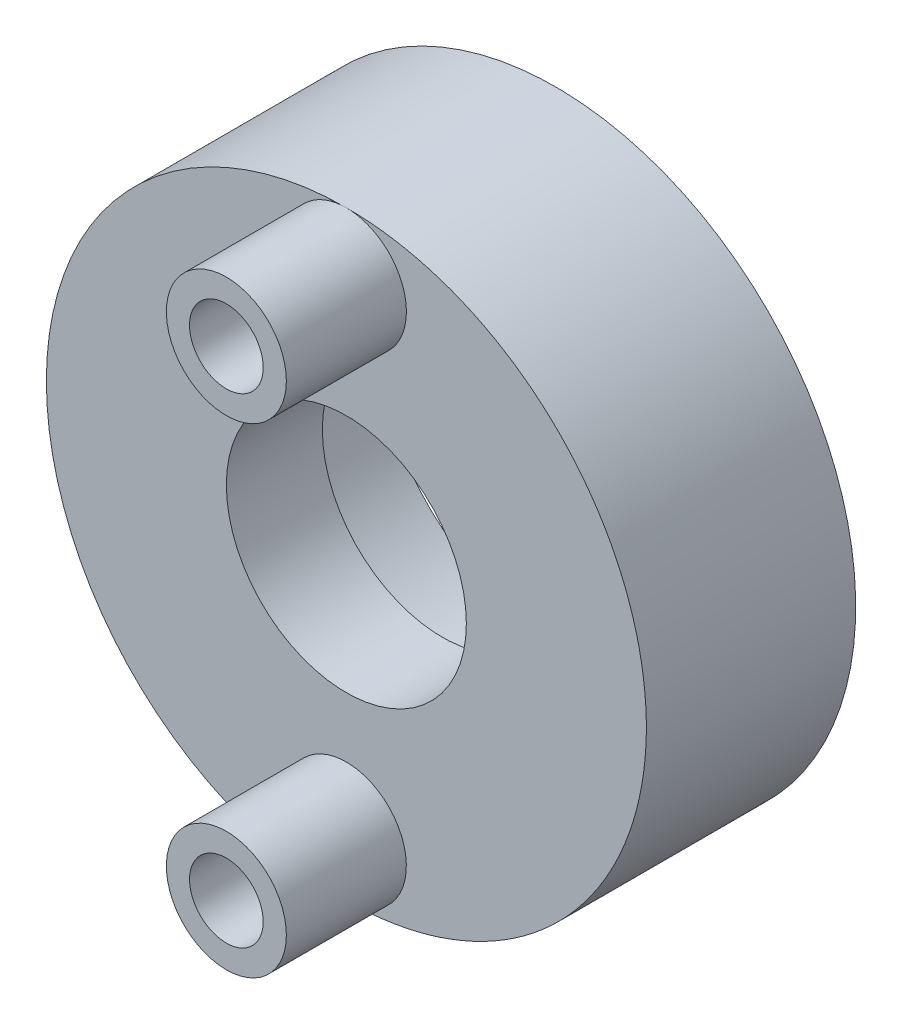
ISO-10303-21;
HEADER;
FILE_DESCRIPTION(('STEP AP214'),'2;1');
FILE_NAME('part.step','',(''),(''),'','','');
FILE_SCHEMA(('AUTOMOTIVE_DESIGN { 1 0 10303 214 1 1 1 1 }'));
ENDSEC;
DATA;
#1=APPLICATION_CONTEXT('core data for automotive mechanical design processes');
#2=APPLICATION_PROTOCOL_DEFINITION('international standard','automotive_design',2000,#1);
#3=PRODUCT_CONTEXT('',#1,'mechanical');
#4=PRODUCT('Part','Part','',(#3));
#5=PRODUCT_RELATED_PRODUCT_CATEGORY('part','',(#4));
#6=PRODUCT_DEFINITION_FORMATION('','',#4);
#7=PRODUCT_DEFINITION_CONTEXT('part definition',#1,'design');
#8=PRODUCT_DEFINITION('design','',#6,#7);
#9=PRODUCT_DEFINITION_SHAPE('','',#8);
#10=(LENGTH_UNIT() NAMED_UNIT(*) SI_UNIT(.MILLI.,.METRE.));
#11=(NAMED_UNIT(*) PLANE_ANGLE_UNIT() SI_UNIT($,.RADIAN.));
#12=(NAMED_UNIT(*) SI_UNIT($,.STERADIAN.) SOLID_ANGLE_UNIT());
#13=UNCERTAINTY_MEASURE_WITH_UNIT(LENGTH_MEASURE(1.E-05),#10,'distance_accuracy_value','');
#14=(GEOMETRIC_REPRESENTATION_CONTEXT(3) GLOBAL_UNCERTAINTY_ASSIGNED_CONTEXT((#13)) GLOBAL_UNIT_ASSIGNED_CONTEXT((#10,
#11,#12)) REPRESENTATION_CONTEXT('',''));
#15=CARTESIAN_POINT('',(0.,0.,0.));
#16=DIRECTION('',(0.,0.,1.));
#17=DIRECTION('',(1.,0.,0.));
#18=AXIS2_PLACEMENT_3D('',#15,#16,#17);
#19=CARTESIAN_POINT('',(0.,0.,-5.08));
#20=DIRECTION('',(0.,0.,1.));
#21=DIRECTION('',(1.,0.,0.));
#22=AXIS2_PLACEMENT_3D('',#19,#20,#21);
#23=PLANE('',#22);
#24=CARTESIAN_POINT('',(0.,0.,-5.08));
#25=DIRECTION('',(0.,0.,1.));
#26=DIRECTION('',(1.,0.,0.));
#27=AXIS2_PLACEMENT_3D('',#24,#25,#26);
#28=CIRCLE('',#27,6.35);
#29=CARTESIAN_POINT('',(6.35,0.,-5.08));
#30=VERTEX_POINT('',#29);
#31=EDGE_CURVE('E60',#30,#30,#28,.T.);
#32=ORIENTED_EDGE('',*,*,#31,.T.);
#33=EDGE_LOOP('',(#32));
#34=FACE_BOUND('',#33,.T.);
#35=CARTESIAN_POINT('',(0.,0.,-5.08));
#36=DIRECTION('',(0.,0.,-1.));
#37=DIRECTION('',(-1.,0.,0.));
#38=AXIS2_PLACEMENT_3D('',#35,#36,#37);
#39=CIRCLE('',#38,9.5);
#40=CARTESIAN_POINT('',(-9.5,0.,-5.08));
#41=VERTEX_POINT('',#40);
#42=EDGE_CURVE('E116',#41,#41,#39,.T.);
#43=ORIENTED_EDGE('',*,*,#42,.T.);
#44=EDGE_LOOP('',(#43));
#45=FACE_BOUND('',#44,.T.);
#46=ADVANCED_FACE('F50',(#34,#45),#23,.F.);
#47=CARTESIAN_POINT('',(0.,0.,0.));
#48=DIRECTION('',(0.,0.,1.));
#49=DIRECTION('',(1.,0.,0.));
#50=AXIS2_PLACEMENT_3D('',#47,#48,#49);
#51=PLANE('',#50);
#52=CARTESIAN_POINT('',(0.,0.,0.));
#53=DIRECTION('',(0.,0.,1.));
#54=DIRECTION('',(1.,0.,0.));
#55=AXIS2_PLACEMENT_3D('',#52,#53,#54);
#56=CIRCLE('',#55,6.35);
#57=CARTESIAN_POINT('',(6.35,0.,0.));
#58=VERTEX_POINT('',#57);
#59=EDGE_CURVE('E78',#58,#58,#56,.T.);
#60=ORIENTED_EDGE('',*,*,#59,.F.);
#61=EDGE_LOOP('',(#60));
#62=FACE_BOUND('',#61,.T.);
#63=CARTESIAN_POINT('',(0.,0.,0.));
#64=DIRECTION('',(0.,0.,1.));
#65=DIRECTION('',(1.,0.,0.));
#66=AXIS2_PLACEMENT_3D('',#63,#64,#65);
#67=CIRCLE('',#66,15.875);
#68=CARTESIAN_POINT('',(0.,-15.875,0.));
#69=VERTEX_POINT('',#68);
#70=CARTESIAN_POINT('',(0.,15.875,0.));
#71=VERTEX_POINT('',#70);
#72=EDGE_CURVE('E72',#69,#71,#67,.T.);
#73=ORIENTED_EDGE('',*,*,#72,.T.);
#74=CARTESIAN_POINT('',(0.,12.7,0.));
#75=DIRECTION('',(0.,0.,1.));
#76=DIRECTION('',(1.,0.,0.));
#77=AXIS2_PLACEMENT_3D('',#74,#75,#76);
#78=CIRCLE('',#77,3.175);
#79=EDGE_CURVE('E76',#71,#71,#78,.T.);
#80=ORIENTED_EDGE('',*,*,#79,.F.);
#81=EDGE_CURVE('E51',#71,#69,#67,.T.);
#82=ORIENTED_EDGE('',*,*,#81,.T.);
#83=CARTESIAN_POINT('',(0.,-12.7,0.));
#84=DIRECTION('',(0.,0.,1.));
#85=DIRECTION('',(1.,0.,0.));
#86=AXIS2_PLACEMENT_3D('',#83,#84,#85);
#87=CIRCLE('',#86,3.175);
#88=EDGE_CURVE('E65',#69,#69,#87,.F.);
#89=ORIENTED_EDGE('',*,*,#88,.T.);
#90=EDGE_LOOP('',(#73,#80,#82,#89));
#91=FACE_BOUND('',#90,.T.);
#92=ADVANCED_FACE('F73',(#62,#91),#51,.T.);
#93=CARTESIAN_POINT('',(0.,12.7,-5.08));
#94=DIRECTION('',(0.,0.,1.));
#95=DIRECTION('',(1.,0.,0.));
#96=AXIS2_PLACEMENT_3D('',#93,#94,#95);
#97=CYLINDRICAL_SURFACE('',#96,1.95);
#98=CARTESIAN_POINT('',(0.,12.7,-5.08));
#99=DIRECTION('',(0.,0.,1.));
#100=DIRECTION('',(1.,0.,0.));
#101=AXIS2_PLACEMENT_3D('',#98,#99,#100);
#102=CIRCLE('',#101,1.95);
#103=CARTESIAN_POINT('',(1.95,12.7,-5.08));
#104=VERTEX_POINT('',#103);
#105=EDGE_CURVE('E11',#104,#104,#102,.T.);
#106=ORIENTED_EDGE('',*,*,#105,.F.);
#107=EDGE_LOOP('',(#106));
#108=FACE_BOUND('',#107,.T.);
#109=CARTESIAN_POINT('',(0.,12.7,6.35));
#110=DIRECTION('',(0.,0.,1.));
#111=DIRECTION('',(1.,0.,0.));
#112=AXIS2_PLACEMENT_3D('',#109,#110,#111);
#113=CIRCLE('',#112,1.95);
#114=CARTESIAN_POINT('',(1.95,12.7,6.35));
#115=VERTEX_POINT('',#114);
#116=EDGE_CURVE('E87',#115,#115,#113,.T.);
#117=ORIENTED_EDGE('',*,*,#116,.T.);
#118=EDGE_LOOP('',(#117));
#119=FACE_BOUND('',#118,.T.);
#120=ADVANCED_FACE('F147',(#108,#119),#97,.F.);
#121=CARTESIAN_POINT('',(0.,0.,-5.08));
#122=DIRECTION('',(0.,0.,1.));
#123=DIRECTION('',(1.,0.,0.));
#124=AXIS2_PLACEMENT_3D('',#121,#122,#123);
#125=CYLINDRICAL_SURFACE('',#124,15.875);
#126=ORIENTED_EDGE('',*,*,#81,.F.);
#127=ORIENTED_EDGE('',*,*,#72,.F.);
#128=EDGE_LOOP('',(#126,#127));
#129=FACE_BOUND('',#128,.T.);
#130=CARTESIAN_POINT('',(0.,0.,-11.08));
#131=DIRECTION('',(0.,0.,-1.));
#132=DIRECTION('',(-1.,0.,0.));
#133=AXIS2_PLACEMENT_3D('',#130,#131,#132);
#134=CIRCLE('',#133,15.875);
#135=CARTESIAN_POINT('',(-15.875,0.,-11.08));
#136=VERTEX_POINT('',#135);
#137=EDGE_CURVE('E91',#136,#136,#134,.T.);
#138=ORIENTED_EDGE('',*,*,#137,.F.);
#139=EDGE_LOOP('',(#138));
#140=FACE_BOUND('',#139,.T.);
#141=ADVANCED_FACE('F68',(#129,#140),#125,.T.);
#142=CARTESIAN_POINT('',(0.,0.,-5.08));
#143=DIRECTION('',(0.,0.,1.));
#144=DIRECTION('',(1.,0.,0.));
#145=AXIS2_PLACEMENT_3D('',#142,#143,#144);
#146=CYLINDRICAL_SURFACE('',#145,6.35);
#147=ORIENTED_EDGE('',*,*,#31,.F.);
#148=EDGE_LOOP('',(#147));
#149=FACE_BOUND('',#148,.T.);
#150=ORIENTED_EDGE('',*,*,#59,.T.);
#151=EDGE_LOOP('',(#150));
#152=FACE_BOUND('',#151,.T.);
#153=ADVANCED_FACE('F47',(#149,#152),#146,.F.);
#154=CARTESIAN_POINT('',(0.,-12.7,-5.08));
#155=DIRECTION('',(0.,0.,1.));
#156=DIRECTION('',(1.,0.,0.));
#157=AXIS2_PLACEMENT_3D('',#154,#155,#156);
#158=CYLINDRICAL_SURFACE('',#157,1.95);
#159=CARTESIAN_POINT('',(0.,-12.7,-5.08));
#160=DIRECTION('',(0.,0.,1.));
#161=DIRECTION('',(1.,0.,0.));
#162=AXIS2_PLACEMENT_3D('',#159,#160,#161);
#163=CIRCLE('',#162,1.95);
#164=CARTESIAN_POINT('',(1.95,-12.7,-5.08));
#165=VERTEX_POINT('',#164);
#166=EDGE_CURVE('E89',#165,#165,#163,.F.);
#167=ORIENTED_EDGE('',*,*,#166,.T.);
#168=EDGE_LOOP('',(#167));
#169=FACE_BOUND('',#168,.T.);
#170=CARTESIAN_POINT('',(0.,-12.7,6.35));
#171=DIRECTION('',(0.,0.,1.));
#172=DIRECTION('',(1.,0.,0.));
#173=AXIS2_PLACEMENT_3D('',#170,#171,#172);
#174=CIRCLE('',#173,1.95);
#175=CARTESIAN_POINT('',(1.95,-12.7,6.35));
#176=VERTEX_POINT('',#175);
#177=EDGE_CURVE('E101',#176,#176,#174,.F.);
#178=ORIENTED_EDGE('',*,*,#177,.F.);
#179=EDGE_LOOP('',(#178));
#180=FACE_BOUND('',#179,.T.);
#181=ADVANCED_FACE('F158',(#169,#180),#158,.F.);
#182=CARTESIAN_POINT('',(0.,-12.7,6.35));
#183=DIRECTION('',(0.,0.,-1.));
#184=DIRECTION('',(-1.,0.,0.));
#185=AXIS2_PLACEMENT_3D('',#182,#183,#184);
#186=CYLINDRICAL_SURFACE('',#185,3.175);
#187=CARTESIAN_POINT('',(0.,-12.7,6.35));
#188=DIRECTION('',(0.,0.,1.));
#189=DIRECTION('',(1.,0.,0.));
#190=AXIS2_PLACEMENT_3D('',#187,#188,#189);
#191=CIRCLE('',#190,3.175);
#192=CARTESIAN_POINT('',(3.175,-12.7,6.35));
#193=VERTEX_POINT('',#192);
#194=EDGE_CURVE('E99',#193,#193,#191,.F.);
#195=ORIENTED_EDGE('',*,*,#194,.T.);
#196=EDGE_LOOP('',(#195));
#197=FACE_BOUND('',#196,.T.);
#198=ORIENTED_EDGE('',*,*,#88,.F.);
#199=EDGE_LOOP('',(#198));
#200=FACE_BOUND('',#199,.T.);
#201=ADVANCED_FACE('F154',(#197,#200),#186,.T.);
#202=CARTESIAN_POINT('',(0.,0.,6.35));
#203=DIRECTION('',(0.,0.,1.));
#204=DIRECTION('',(1.,0.,0.));
#205=AXIS2_PLACEMENT_3D('',#202,#203,#204);
#206=PLANE('',#205);
#207=ORIENTED_EDGE('',*,*,#194,.F.);
#208=EDGE_LOOP('',(#207));
#209=FACE_BOUND('',#208,.T.);
#210=ORIENTED_EDGE('',*,*,#177,.T.);
#211=EDGE_LOOP('',(#210));
#212=FACE_BOUND('',#211,.T.);
#213=ADVANCED_FACE('F192',(#209,#212),#206,.T.);
#214=CARTESIAN_POINT('',(0.,12.7,6.35));
#215=DIRECTION('',(0.,0.,-1.));
#216=DIRECTION('',(-1.,0.,0.));
#217=AXIS2_PLACEMENT_3D('',#214,#215,#216);
#218=CYLINDRICAL_SURFACE('',#217,3.175);
#219=CARTESIAN_POINT('',(0.,12.7,6.35));
#220=DIRECTION('',(0.,0.,1.));
#221=DIRECTION('',(1.,0.,0.));
#222=AXIS2_PLACEMENT_3D('',#219,#220,#221);
#223=CIRCLE('',#222,3.175);
#224=CARTESIAN_POINT('',(3.175,12.7,6.35));
#225=VERTEX_POINT('',#224);
#226=EDGE_CURVE('E81',#225,#225,#223,.T.);
#227=ORIENTED_EDGE('',*,*,#226,.F.);
#228=EDGE_LOOP('',(#227));
#229=FACE_BOUND('',#228,.T.);
#230=ORIENTED_EDGE('',*,*,#79,.T.);
#231=EDGE_LOOP('',(#230));
#232=FACE_BOUND('',#231,.T.);
#233=ADVANCED_FACE('F205',(#229,#232),#218,.T.);
#234=CARTESIAN_POINT('',(0.,0.,6.35));
#235=DIRECTION('',(0.,0.,1.));
#236=DIRECTION('',(1.,0.,0.));
#237=AXIS2_PLACEMENT_3D('',#234,#235,#236);
#238=PLANE('',#237);
#239=ORIENTED_EDGE('',*,*,#116,.F.);
#240=EDGE_LOOP('',(#239));
#241=FACE_BOUND('',#240,.T.);
#242=ORIENTED_EDGE('',*,*,#226,.T.);
#243=EDGE_LOOP('',(#242));
#244=FACE_BOUND('',#243,.T.);
#245=ADVANCED_FACE('F137',(#241,#244),#238,.T.);
#246=CARTESIAN_POINT('',(0.,0.,-11.08));
#247=DIRECTION('',(0.,0.,1.));
#248=DIRECTION('',(1.,0.,0.));
#249=AXIS2_PLACEMENT_3D('',#246,#247,#248);
#250=CYLINDRICAL_SURFACE('',#249,9.5);
#251=CARTESIAN_POINT('',(0.,0.,-11.08));
#252=DIRECTION('',(0.,0.,-1.));
#253=DIRECTION('',(-1.,0.,0.));
#254=AXIS2_PLACEMENT_3D('',#251,#252,#253);
#255=CIRCLE('',#254,9.5);
#256=CARTESIAN_POINT('',(-9.5,0.,-11.08));
#257=VERTEX_POINT('',#256);
#258=EDGE_CURVE('E119',#257,#257,#255,.T.);
#259=ORIENTED_EDGE('',*,*,#258,.T.);
#260=EDGE_LOOP('',(#259));
#261=FACE_BOUND('',#260,.T.);
#262=ORIENTED_EDGE('',*,*,#42,.F.);
#263=EDGE_LOOP('',(#262));
#264=FACE_BOUND('',#263,.T.);
#265=ADVANCED_FACE('F122',(#261,#264),#250,.F.);
#266=CARTESIAN_POINT('',(0.,0.,-11.08));
#267=DIRECTION('',(0.,0.,-1.));
#268=DIRECTION('',(-1.,0.,0.));
#269=AXIS2_PLACEMENT_3D('',#266,#267,#268);
#270=PLANE('',#269);
#271=ORIENTED_EDGE('',*,*,#137,.T.);
#272=EDGE_LOOP('',(#271));
#273=FACE_BOUND('',#272,.T.);
#274=ORIENTED_EDGE('',*,*,#258,.F.);
#275=EDGE_LOOP('',(#274));
#276=FACE_BOUND('',#275,.T.);
#277=ADVANCED_FACE('F126',(#273,#276),#270,.T.);
#278=CARTESIAN_POINT('',(0.,0.,-5.08));
#279=DIRECTION('',(0.,0.,-1.));
#280=DIRECTION('',(-1.,0.,0.));
#281=AXIS2_PLACEMENT_3D('',#278,#279,#280);
#282=PLANE('',#281);
#283=ORIENTED_EDGE('',*,*,#166,.F.);
#284=EDGE_LOOP('',(#283));
#285=FACE_BOUND('',#284,.T.);
#286=ADVANCED_FACE('F128',(#285),#282,.F.);
#287=ORIENTED_EDGE('',*,*,#105,.T.);
#288=EDGE_LOOP('',(#287));
#289=FACE_BOUND('',#288,.T.);
#290=ADVANCED_FACE('F136',(#289),#282,.F.);
#291=CLOSED_SHELL('',(#46,#92,#120,#141,#153,#181,#201,#213,#233,#245,#265,#277,#286,#290));
#292=MANIFOLD_SOLID_BREP('B2',#291);
#293=ADVANCED_BREP_SHAPE_REPRESENTATION('',(#18,#292),#14);
#294=SHAPE_DEFINITION_REPRESENTATION(#9,#293);
ENDSEC;
END-ISO-10303-21;
